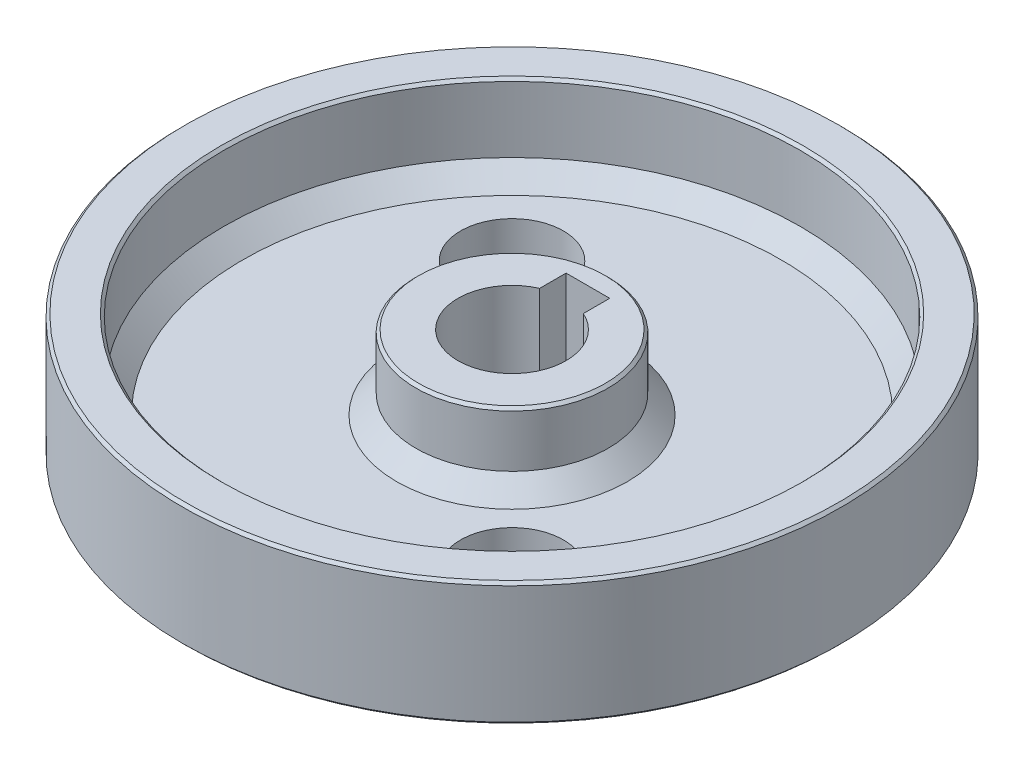
ISO-10303-21;
HEADER;
FILE_DESCRIPTION(('STEP AP214'),'2;1');
FILE_NAME('part.step','',(''),(''),'','','');
FILE_SCHEMA(('AUTOMOTIVE_DESIGN { 1 0 10303 214 1 1 1 1 }'));
ENDSEC;
DATA;
#1=APPLICATION_CONTEXT('core data for automotive mechanical design processes');
#2=APPLICATION_PROTOCOL_DEFINITION('international standard','automotive_design',2000,#1);
#3=PRODUCT_CONTEXT('',#1,'mechanical');
#4=PRODUCT('Part','Part','',(#3));
#5=PRODUCT_RELATED_PRODUCT_CATEGORY('part','',(#4));
#6=PRODUCT_DEFINITION_FORMATION('','',#4);
#7=PRODUCT_DEFINITION_CONTEXT('part definition',#1,'design');
#8=PRODUCT_DEFINITION('design','',#6,#7);
#9=PRODUCT_DEFINITION_SHAPE('','',#8);
#10=(LENGTH_UNIT() NAMED_UNIT(*) SI_UNIT(.MILLI.,.METRE.));
#11=(NAMED_UNIT(*) PLANE_ANGLE_UNIT() SI_UNIT($,.RADIAN.));
#12=(NAMED_UNIT(*) SI_UNIT($,.STERADIAN.) SOLID_ANGLE_UNIT());
#13=UNCERTAINTY_MEASURE_WITH_UNIT(LENGTH_MEASURE(1.E-05),#10,'distance_accuracy_value','');
#14=(GEOMETRIC_REPRESENTATION_CONTEXT(3) GLOBAL_UNCERTAINTY_ASSIGNED_CONTEXT((#13)) GLOBAL_UNIT_ASSIGNED_CONTEXT((#10,
#11,#12)) REPRESENTATION_CONTEXT('',''));
#15=CARTESIAN_POINT('',(0.,0.,0.));
#16=DIRECTION('',(0.,0.,1.));
#17=DIRECTION('',(1.,0.,0.));
#18=AXIS2_PLACEMENT_3D('',#15,#16,#17);
#19=CARTESIAN_POINT('',(0.,11.43,0.));
#20=DIRECTION('',(0.,1.,0.));
#21=DIRECTION('',(-1.,0.,0.));
#22=AXIS2_PLACEMENT_3D('',#19,#20,#21);
#23=CONICAL_SURFACE('',#22,26.924,0.785398163397438);
#24=CARTESIAN_POINT('',(0.,11.176,0.));
#25=DIRECTION('',(0.,-1.,0.));
#26=DIRECTION('',(0.,0.,-1.));
#27=AXIS2_PLACEMENT_3D('',#24,#25,#26);
#28=CIRCLE('',#27,26.67);
#29=CARTESIAN_POINT('',(0.,11.176,-26.67));
#30=VERTEX_POINT('',#29);
#31=EDGE_CURVE('E122',#30,#30,#28,.T.);
#32=ORIENTED_EDGE('',*,*,#31,.T.);
#33=EDGE_LOOP('',(#32));
#34=FACE_BOUND('',#33,.T.);
#35=CARTESIAN_POINT('',(0.,11.43,0.));
#36=DIRECTION('',(0.,1.,0.));
#37=DIRECTION('',(-1.,0.,0.));
#38=AXIS2_PLACEMENT_3D('',#35,#36,#37);
#39=CIRCLE('',#38,26.924);
#40=CARTESIAN_POINT('',(-26.924,11.43,0.));
#41=VERTEX_POINT('',#40);
#42=EDGE_CURVE('E19',#41,#41,#39,.F.);
#43=ORIENTED_EDGE('',*,*,#42,.F.);
#44=EDGE_LOOP('',(#43));
#45=FACE_BOUND('',#44,.T.);
#46=ADVANCED_FACE('F16',(#34,#45),#23,.F.);
#47=CARTESIAN_POINT('',(0.,0.,0.));
#48=DIRECTION('',(0.,-1.,0.));
#49=DIRECTION('',(0.,0.,-1.));
#50=AXIS2_PLACEMENT_3D('',#47,#48,#49);
#51=CYLINDRICAL_SURFACE('',#50,26.67);
#52=CARTESIAN_POINT('',(0.,5.08000000000003,0.));
#53=DIRECTION('',(0.,1.,0.));
#54=DIRECTION('',(0.,0.,1.));
#55=AXIS2_PLACEMENT_3D('',#52,#53,#54);
#56=CIRCLE('',#55,26.67);
#57=CARTESIAN_POINT('',(0.,5.08000000000003,26.67));
#58=VERTEX_POINT('',#57);
#59=EDGE_CURVE('E119',#58,#58,#56,.F.);
#60=ORIENTED_EDGE('',*,*,#59,.T.);
#61=EDGE_LOOP('',(#60));
#62=FACE_BOUND('',#61,.T.);
#63=ORIENTED_EDGE('',*,*,#31,.F.);
#64=EDGE_LOOP('',(#63));
#65=FACE_BOUND('',#64,.T.);
#66=ADVANCED_FACE('F155',(#62,#65),#51,.F.);
#67=CARTESIAN_POINT('',(0.,11.43,0.));
#68=DIRECTION('',(0.,1.,0.));
#69=DIRECTION('',(0.,0.,1.));
#70=AXIS2_PLACEMENT_3D('',#67,#68,#69);
#71=PLANE('',#70);
#72=CARTESIAN_POINT('',(0.,11.43,0.));
#73=DIRECTION('',(0.,-1.,0.));
#74=DIRECTION('',(0.,0.,-1.));
#75=AXIS2_PLACEMENT_3D('',#72,#73,#74);
#76=CIRCLE('',#75,30.226);
#77=CARTESIAN_POINT('',(0.,11.43,-30.226));
#78=VERTEX_POINT('',#77);
#79=EDGE_CURVE('E115',#78,#78,#76,.T.);
#80=ORIENTED_EDGE('',*,*,#79,.F.);
#81=EDGE_LOOP('',(#80));
#82=FACE_BOUND('',#81,.T.);
#83=ORIENTED_EDGE('',*,*,#42,.T.);
#84=EDGE_LOOP('',(#83));
#85=FACE_BOUND('',#84,.T.);
#86=ADVANCED_FACE('F151',(#82,#85),#71,.T.);
#87=CARTESIAN_POINT('',(0.,0.,0.));
#88=DIRECTION('',(0.,-1.,0.));
#89=DIRECTION('',(0.,0.,-1.));
#90=AXIS2_PLACEMENT_3D('',#87,#88,#89);
#91=CYLINDRICAL_SURFACE('',#90,8.89);
#92=CARTESIAN_POINT('',(0.,5.08,0.));
#93=DIRECTION('',(0.,-1.,0.));
#94=DIRECTION('',(0.,0.,-1.));
#95=AXIS2_PLACEMENT_3D('',#92,#93,#94);
#96=CIRCLE('',#95,8.89);
#97=CARTESIAN_POINT('',(0.,5.08,-8.89));
#98=VERTEX_POINT('',#97);
#99=EDGE_CURVE('E116',#98,#98,#96,.T.);
#100=ORIENTED_EDGE('',*,*,#99,.F.);
#101=EDGE_LOOP('',(#100));
#102=FACE_BOUND('',#101,.T.);
#103=CARTESIAN_POINT('',(0.,9.90599999999998,0.));
#104=DIRECTION('',(0.,-1.,0.));
#105=DIRECTION('',(0.,0.,-1.));
#106=AXIS2_PLACEMENT_3D('',#103,#104,#105);
#107=CIRCLE('',#106,8.89);
#108=CARTESIAN_POINT('',(0.,9.90599999999998,-8.89));
#109=VERTEX_POINT('',#108);
#110=EDGE_CURVE('E111',#109,#109,#107,.F.);
#111=ORIENTED_EDGE('',*,*,#110,.F.);
#112=EDGE_LOOP('',(#111));
#113=FACE_BOUND('',#112,.T.);
#114=ADVANCED_FACE('F154',(#102,#113),#91,.T.);
#115=CARTESIAN_POINT('',(0.,5.08000000000003,0.));
#116=DIRECTION('',(0.,1.,0.));
#117=DIRECTION('',(0.,0.,1.));
#118=AXIS2_PLACEMENT_3D('',#115,#116,#117);
#119=CONICAL_SURFACE('',#118,26.67,0.785398163397441);
#120=ORIENTED_EDGE('',*,*,#59,.F.);
#121=EDGE_LOOP('',(#120));
#122=FACE_BOUND('',#121,.T.);
#123=CARTESIAN_POINT('',(0.,3.302,0.));
#124=DIRECTION('',(0.,1.,0.));
#125=DIRECTION('',(0.,0.,1.));
#126=AXIS2_PLACEMENT_3D('',#123,#124,#125);
#127=CIRCLE('',#126,24.892);
#128=CARTESIAN_POINT('',(0.,3.302,24.892));
#129=VERTEX_POINT('',#128);
#130=EDGE_CURVE('E114',#129,#129,#127,.F.);
#131=ORIENTED_EDGE('',*,*,#130,.T.);
#132=EDGE_LOOP('',(#131));
#133=FACE_BOUND('',#132,.T.);
#134=ADVANCED_FACE('F218',(#122,#133),#119,.F.);
#135=CARTESIAN_POINT('',(0.,3.302,0.));
#136=DIRECTION('',(0.,-1.,0.));
#137=DIRECTION('',(0.,0.,-1.));
#138=AXIS2_PLACEMENT_3D('',#135,#136,#137);
#139=CONICAL_SURFACE('',#138,10.668,0.78539816339745);
#140=CARTESIAN_POINT('',(0.,3.302,0.));
#141=DIRECTION('',(0.,-1.,0.));
#142=DIRECTION('',(0.,0.,-1.));
#143=AXIS2_PLACEMENT_3D('',#140,#141,#142);
#144=CIRCLE('',#143,10.668);
#145=CARTESIAN_POINT('',(0.,3.302,-10.668));
#146=VERTEX_POINT('',#145);
#147=EDGE_CURVE('E110',#146,#146,#144,.F.);
#148=ORIENTED_EDGE('',*,*,#147,.T.);
#149=EDGE_LOOP('',(#148));
#150=FACE_BOUND('',#149,.T.);
#151=ORIENTED_EDGE('',*,*,#99,.T.);
#152=EDGE_LOOP('',(#151));
#153=FACE_BOUND('',#152,.T.);
#154=ADVANCED_FACE('F215',(#150,#153),#139,.T.);
#155=CARTESIAN_POINT('',(0.,11.176,0.));
#156=DIRECTION('',(0.,-1.,0.));
#157=DIRECTION('',(0.,0.,-1.));
#158=AXIS2_PLACEMENT_3D('',#155,#156,#157);
#159=CONICAL_SURFACE('',#158,30.48,0.785398163397469);
#160=ORIENTED_EDGE('',*,*,#79,.T.);
#161=EDGE_LOOP('',(#160));
#162=FACE_BOUND('',#161,.T.);
#163=CARTESIAN_POINT('',(0.,11.176,0.));
#164=DIRECTION('',(0.,-1.,0.));
#165=DIRECTION('',(0.,0.,-1.));
#166=AXIS2_PLACEMENT_3D('',#163,#164,#165);
#167=CIRCLE('',#166,30.48);
#168=CARTESIAN_POINT('',(0.,11.176,-30.48));
#169=VERTEX_POINT('',#168);
#170=EDGE_CURVE('E106',#169,#169,#167,.T.);
#171=ORIENTED_EDGE('',*,*,#170,.F.);
#172=EDGE_LOOP('',(#171));
#173=FACE_BOUND('',#172,.T.);
#174=ADVANCED_FACE('F148',(#162,#173),#159,.T.);
#175=CARTESIAN_POINT('',(0.,9.90599999999998,0.));
#176=DIRECTION('',(0.,-1.,0.));
#177=DIRECTION('',(0.,0.,-1.));
#178=AXIS2_PLACEMENT_3D('',#175,#176,#177);
#179=CONICAL_SURFACE('',#178,8.89,0.785398163397435);
#180=ORIENTED_EDGE('',*,*,#110,.T.);
#181=EDGE_LOOP('',(#180));
#182=FACE_BOUND('',#181,.T.);
#183=CARTESIAN_POINT('',(0.,10.16,0.));
#184=DIRECTION('',(0.,-1.,0.));
#185=DIRECTION('',(0.,0.,-1.));
#186=AXIS2_PLACEMENT_3D('',#183,#184,#185);
#187=CIRCLE('',#186,8.63599999999998);
#188=CARTESIAN_POINT('',(0.,10.16,-8.63599999999998));
#189=VERTEX_POINT('',#188);
#190=EDGE_CURVE('E109',#189,#189,#187,.F.);
#191=ORIENTED_EDGE('',*,*,#190,.F.);
#192=EDGE_LOOP('',(#191));
#193=FACE_BOUND('',#192,.T.);
#194=ADVANCED_FACE('F208',(#182,#193),#179,.T.);
#195=CARTESIAN_POINT('',(24.892,3.302,0.));
#196=DIRECTION('',(0.,-1.,0.));
#197=DIRECTION('',(0.,0.,-1.));
#198=AXIS2_PLACEMENT_3D('',#195,#196,#197);
#199=PLANE('',#198);
#200=ORIENTED_EDGE('',*,*,#147,.F.);
#201=EDGE_LOOP('',(#200));
#202=FACE_BOUND('',#201,.T.);
#203=ORIENTED_EDGE('',*,*,#130,.F.);
#204=EDGE_LOOP('',(#203));
#205=FACE_BOUND('',#204,.T.);
#206=CARTESIAN_POINT('',(-12.375217198902,3.302,-12.3743686707646));
#207=DIRECTION('',(0.,1.,0.));
#208=DIRECTION('',(0.,0.,1.));
#209=AXIS2_PLACEMENT_3D('',#206,#207,#208);
#210=CIRCLE('',#209,4.7625);
#211=CARTESIAN_POINT('',(-12.375217198902,3.302,-7.61186867076458));
#212=VERTEX_POINT('',#211);
#213=EDGE_CURVE('E105',#212,#212,#210,.F.);
#214=ORIENTED_EDGE('',*,*,#213,.T.);
#215=EDGE_LOOP('',(#214));
#216=FACE_BOUND('',#215,.T.);
#217=CARTESIAN_POINT('',(12.3743686707647,3.302,12.3752171989019));
#218=DIRECTION('',(0.,1.,0.));
#219=DIRECTION('',(0.,0.,1.));
#220=AXIS2_PLACEMENT_3D('',#217,#218,#219);
#221=CIRCLE('',#220,4.7625);
#222=CARTESIAN_POINT('',(12.3743686707647,3.302,17.1377171989019));
#223=VERTEX_POINT('',#222);
#224=EDGE_CURVE('E137',#223,#223,#221,.F.);
#225=ORIENTED_EDGE('',*,*,#224,.T.);
#226=EDGE_LOOP('',(#225));
#227=FACE_BOUND('',#226,.T.);
#228=ADVANCED_FACE('F204',(#202,#205,#216,#227),#199,.F.);
#229=CARTESIAN_POINT('',(0.,11.43,0.));
#230=DIRECTION('',(0.,-1.,0.));
#231=DIRECTION('',(0.,0.,-1.));
#232=AXIS2_PLACEMENT_3D('',#229,#230,#231);
#233=CYLINDRICAL_SURFACE('',#232,30.48);
#234=ORIENTED_EDGE('',*,*,#170,.T.);
#235=EDGE_LOOP('',(#234));
#236=FACE_BOUND('',#235,.T.);
#237=CARTESIAN_POINT('',(0.,0.254000000000004,0.));
#238=DIRECTION('',(0.,1.,0.));
#239=DIRECTION('',(0.,0.,1.));
#240=AXIS2_PLACEMENT_3D('',#237,#238,#239);
#241=CIRCLE('',#240,30.48);
#242=CARTESIAN_POINT('',(0.,0.254000000000005,30.48));
#243=VERTEX_POINT('',#242);
#244=EDGE_CURVE('E100',#243,#243,#241,.F.);
#245=ORIENTED_EDGE('',*,*,#244,.F.);
#246=EDGE_LOOP('',(#245));
#247=FACE_BOUND('',#246,.T.);
#248=ADVANCED_FACE('F201',(#236,#247),#233,.T.);
#249=CARTESIAN_POINT('',(0.,10.16,0.));
#250=DIRECTION('',(0.,1.,0.));
#251=DIRECTION('',(0.,0.,1.));
#252=AXIS2_PLACEMENT_3D('',#249,#250,#251);
#253=PLANE('',#252);
#254=DIRECTION('',(0.,0.,-1.));
#255=VECTOR('',#254,1.);
#256=CARTESIAN_POINT('',(2.0193,10.16,-7.0193));
#257=LINE('',#256,#255);
#258=CARTESIAN_POINT('',(2.0193,10.16,-7.0193));
#259=VERTEX_POINT('',#258);
#260=CARTESIAN_POINT('',(2.0193,10.16,-4.57410401171639));
#261=VERTEX_POINT('',#260);
#262=EDGE_CURVE('E54',#259,#261,#257,.F.);
#263=ORIENTED_EDGE('',*,*,#262,.T.);
#264=CARTESIAN_POINT('',(0.,10.16,0.));
#265=DIRECTION('',(0.,-1.,0.));
#266=DIRECTION('',(0.,0.,-1.));
#267=AXIS2_PLACEMENT_3D('',#264,#265,#266);
#268=CIRCLE('',#267,5.);
#269=CARTESIAN_POINT('',(-2.0193,10.16,-4.57410401171639));
#270=VERTEX_POINT('',#269);
#271=EDGE_CURVE('E56',#261,#270,#268,.T.);
#272=ORIENTED_EDGE('',*,*,#271,.T.);
#273=DIRECTION('',(0.,0.,1.));
#274=VECTOR('',#273,1.);
#275=CARTESIAN_POINT('',(-2.0193,10.16,-7.0193));
#276=LINE('',#275,#274);
#277=CARTESIAN_POINT('',(-2.0193,10.16,-7.0193));
#278=VERTEX_POINT('',#277);
#279=EDGE_CURVE('E60',#270,#278,#276,.F.);
#280=ORIENTED_EDGE('',*,*,#279,.T.);
#281=DIRECTION('',(-1.,0.,0.));
#282=VECTOR('',#281,1.);
#283=CARTESIAN_POINT('',(-2.0193,10.16,-7.0193));
#284=LINE('',#283,#282);
#285=EDGE_CURVE('E85',#278,#259,#284,.F.);
#286=ORIENTED_EDGE('',*,*,#285,.T.);
#287=EDGE_LOOP('',(#263,#272,#280,#286));
#288=FACE_BOUND('',#287,.T.);
#289=ORIENTED_EDGE('',*,*,#190,.T.);
#290=EDGE_LOOP('',(#289));
#291=FACE_BOUND('',#290,.T.);
#292=ADVANCED_FACE('F58',(#288,#291),#253,.T.);
#293=CARTESIAN_POINT('',(12.3743686707647,0.,12.3752171989019));
#294=DIRECTION('',(0.,1.,0.));
#295=DIRECTION('',(0.,0.,1.));
#296=AXIS2_PLACEMENT_3D('',#293,#294,#295);
#297=CYLINDRICAL_SURFACE('',#296,4.7625);
#298=CARTESIAN_POINT('',(12.3743686707647,0.,12.3752171989019));
#299=DIRECTION('',(0.,1.,0.));
#300=DIRECTION('',(0.,0.,1.));
#301=AXIS2_PLACEMENT_3D('',#298,#299,#300);
#302=CIRCLE('',#301,4.7625);
#303=CARTESIAN_POINT('',(12.3743686707647,0.,17.1377171989019));
#304=VERTEX_POINT('',#303);
#305=EDGE_CURVE('E96',#304,#304,#302,.F.);
#306=ORIENTED_EDGE('',*,*,#305,.T.);
#307=EDGE_LOOP('',(#306));
#308=FACE_BOUND('',#307,.T.);
#309=ORIENTED_EDGE('',*,*,#224,.F.);
#310=EDGE_LOOP('',(#309));
#311=FACE_BOUND('',#310,.T.);
#312=ADVANCED_FACE('F194',(#308,#311),#297,.F.);
#313=CARTESIAN_POINT('',(-12.375217198902,0.,-12.3743686707646));
#314=DIRECTION('',(0.,1.,0.));
#315=DIRECTION('',(0.,0.,1.));
#316=AXIS2_PLACEMENT_3D('',#313,#314,#315);
#317=CYLINDRICAL_SURFACE('',#316,4.7625);
#318=CARTESIAN_POINT('',(-12.375217198902,0.,-12.3743686707646));
#319=DIRECTION('',(0.,1.,0.));
#320=DIRECTION('',(0.,0.,1.));
#321=AXIS2_PLACEMENT_3D('',#318,#319,#320);
#322=CIRCLE('',#321,4.7625);
#323=CARTESIAN_POINT('',(-12.375217198902,0.,-7.61186867076458));
#324=VERTEX_POINT('',#323);
#325=EDGE_CURVE('E130',#324,#324,#322,.F.);
#326=ORIENTED_EDGE('',*,*,#325,.T.);
#327=EDGE_LOOP('',(#326));
#328=FACE_BOUND('',#327,.T.);
#329=ORIENTED_EDGE('',*,*,#213,.F.);
#330=EDGE_LOOP('',(#329));
#331=FACE_BOUND('',#330,.T.);
#332=ADVANCED_FACE('F190',(#328,#331),#317,.F.);
#333=CARTESIAN_POINT('',(0.,0.254000000000005,0.));
#334=DIRECTION('',(0.,1.,0.));
#335=DIRECTION('',(0.,0.,1.));
#336=AXIS2_PLACEMENT_3D('',#333,#334,#335);
#337=CONICAL_SURFACE('',#336,30.48,0.785398163397441);
#338=CARTESIAN_POINT('',(0.,0.,0.));
#339=DIRECTION('',(0.,1.,0.));
#340=DIRECTION('',(0.,0.,1.));
#341=AXIS2_PLACEMENT_3D('',#338,#339,#340);
#342=CIRCLE('',#341,30.226);
#343=CARTESIAN_POINT('',(0.,0.,30.226));
#344=VERTEX_POINT('',#343);
#345=EDGE_CURVE('E127',#344,#344,#342,.T.);
#346=ORIENTED_EDGE('',*,*,#345,.T.);
#347=EDGE_LOOP('',(#346));
#348=FACE_BOUND('',#347,.T.);
#349=ORIENTED_EDGE('',*,*,#244,.T.);
#350=EDGE_LOOP('',(#349));
#351=FACE_BOUND('',#350,.T.);
#352=ADVANCED_FACE('F186',(#348,#351),#337,.T.);
#353=CARTESIAN_POINT('',(2.0193,0.,-7.0193));
#354=DIRECTION('',(1.,0.,0.));
#355=DIRECTION('',(0.,0.,-1.));
#356=AXIS2_PLACEMENT_3D('',#353,#354,#355);
#357=PLANE('',#356);
#358=DIRECTION('',(0.,1.,0.));
#359=VECTOR('',#358,1.);
#360=CARTESIAN_POINT('',(2.0193,0.,-7.0193));
#361=LINE('',#360,#359);
#362=CARTESIAN_POINT('',(2.0193,0.,-7.0193));
#363=VERTEX_POINT('',#362);
#364=EDGE_CURVE('E71',#259,#363,#361,.F.);
#365=ORIENTED_EDGE('',*,*,#364,.T.);
#366=DIRECTION('',(0.,0.,1.));
#367=VECTOR('',#366,1.);
#368=CARTESIAN_POINT('',(2.0193,0.,0.));
#369=LINE('',#368,#367);
#370=CARTESIAN_POINT('',(2.0193,0.,-4.57410401171639));
#371=VERTEX_POINT('',#370);
#372=EDGE_CURVE('E126',#363,#371,#369,.T.);
#373=ORIENTED_EDGE('',*,*,#372,.T.);
#374=DIRECTION('',(0.,-1.,0.));
#375=VECTOR('',#374,1.);
#376=CARTESIAN_POINT('',(2.0193,11.43,-4.57410401171639));
#377=LINE('',#376,#375);
#378=EDGE_CURVE('E65',#371,#261,#377,.F.);
#379=ORIENTED_EDGE('',*,*,#378,.T.);
#380=ORIENTED_EDGE('',*,*,#262,.F.);
#381=EDGE_LOOP('',(#365,#373,#379,#380));
#382=FACE_BOUND('',#381,.T.);
#383=ADVANCED_FACE('F183',(#382),#357,.F.);
#384=CARTESIAN_POINT('',(0.,11.43,0.));
#385=DIRECTION('',(0.,-1.,0.));
#386=DIRECTION('',(0.,0.,-1.));
#387=AXIS2_PLACEMENT_3D('',#384,#385,#386);
#388=CYLINDRICAL_SURFACE('',#387,5.);
#389=ORIENTED_EDGE('',*,*,#271,.F.);
#390=ORIENTED_EDGE('',*,*,#378,.F.);
#391=CARTESIAN_POINT('',(0.,0.,0.));
#392=DIRECTION('',(0.,-1.,0.));
#393=DIRECTION('',(0.,0.,-1.));
#394=AXIS2_PLACEMENT_3D('',#391,#392,#393);
#395=CIRCLE('',#394,5.);
#396=CARTESIAN_POINT('',(-2.0193,0.,-4.57410401171639));
#397=VERTEX_POINT('',#396);
#398=EDGE_CURVE('E76',#371,#397,#395,.T.);
#399=ORIENTED_EDGE('',*,*,#398,.T.);
#400=DIRECTION('',(0.,1.,0.));
#401=VECTOR('',#400,1.);
#402=CARTESIAN_POINT('',(-2.0193,0.,-4.57410401171639));
#403=LINE('',#402,#401);
#404=EDGE_CURVE('E64',#397,#270,#403,.T.);
#405=ORIENTED_EDGE('',*,*,#404,.T.);
#406=EDGE_LOOP('',(#389,#390,#399,#405));
#407=FACE_BOUND('',#406,.T.);
#408=ADVANCED_FACE('F74',(#407),#388,.F.);
#409=CARTESIAN_POINT('',(-2.0193,0.,-7.0193));
#410=DIRECTION('',(-1.,0.,0.));
#411=DIRECTION('',(0.,0.,1.));
#412=AXIS2_PLACEMENT_3D('',#409,#410,#411);
#413=PLANE('',#412);
#414=ORIENTED_EDGE('',*,*,#404,.F.);
#415=DIRECTION('',(0.,0.,1.));
#416=VECTOR('',#415,1.);
#417=CARTESIAN_POINT('',(-2.0193,0.,0.));
#418=LINE('',#417,#416);
#419=CARTESIAN_POINT('',(-2.0193,0.,-7.0193));
#420=VERTEX_POINT('',#419);
#421=EDGE_CURVE('E25',#397,#420,#418,.F.);
#422=ORIENTED_EDGE('',*,*,#421,.T.);
#423=DIRECTION('',(0.,1.,0.));
#424=VECTOR('',#423,1.);
#425=CARTESIAN_POINT('',(-2.0193,0.,-7.0193));
#426=LINE('',#425,#424);
#427=EDGE_CURVE('E33',#420,#278,#426,.T.);
#428=ORIENTED_EDGE('',*,*,#427,.T.);
#429=ORIENTED_EDGE('',*,*,#279,.F.);
#430=EDGE_LOOP('',(#414,#422,#428,#429));
#431=FACE_BOUND('',#430,.T.);
#432=ADVANCED_FACE('F68',(#431),#413,.F.);
#433=CARTESIAN_POINT('',(-2.0193,0.,-7.0193));
#434=DIRECTION('',(0.,0.,-1.));
#435=DIRECTION('',(-1.,0.,0.));
#436=AXIS2_PLACEMENT_3D('',#433,#434,#435);
#437=PLANE('',#436);
#438=ORIENTED_EDGE('',*,*,#427,.F.);
#439=DIRECTION('',(1.,0.,0.));
#440=VECTOR('',#439,1.);
#441=CARTESIAN_POINT('',(0.,0.,-7.0193));
#442=LINE('',#441,#440);
#443=EDGE_CURVE('E11',#420,#363,#442,.T.);
#444=ORIENTED_EDGE('',*,*,#443,.T.);
#445=ORIENTED_EDGE('',*,*,#364,.F.);
#446=ORIENTED_EDGE('',*,*,#285,.F.);
#447=EDGE_LOOP('',(#438,#444,#445,#446));
#448=FACE_BOUND('',#447,.T.);
#449=ADVANCED_FACE('F169',(#448),#437,.F.);
#450=CARTESIAN_POINT('',(0.,0.,0.));
#451=DIRECTION('',(0.,1.,0.));
#452=DIRECTION('',(0.,0.,1.));
#453=AXIS2_PLACEMENT_3D('',#450,#451,#452);
#454=PLANE('',#453);
#455=ORIENTED_EDGE('',*,*,#421,.F.);
#456=ORIENTED_EDGE('',*,*,#398,.F.);
#457=ORIENTED_EDGE('',*,*,#372,.F.);
#458=ORIENTED_EDGE('',*,*,#443,.F.);
#459=EDGE_LOOP('',(#455,#456,#457,#458));
#460=FACE_BOUND('',#459,.T.);
#461=ORIENTED_EDGE('',*,*,#345,.F.);
#462=EDGE_LOOP('',(#461));
#463=FACE_BOUND('',#462,.T.);
#464=ORIENTED_EDGE('',*,*,#325,.F.);
#465=EDGE_LOOP('',(#464));
#466=FACE_BOUND('',#465,.T.);
#467=ORIENTED_EDGE('',*,*,#305,.F.);
#468=EDGE_LOOP('',(#467));
#469=FACE_BOUND('',#468,.T.);
#470=ADVANCED_FACE('F167',(#460,#463,#466,#469),#454,.F.);
#471=CLOSED_SHELL('',(#46,#66,#86,#114,#134,#154,#174,#194,#228,#248,#292,#312,#332,#352,#383,
#408,#432,#449,#470));
#472=MANIFOLD_SOLID_BREP('B1',#471);
#473=ADVANCED_BREP_SHAPE_REPRESENTATION('',(#18,#472),#14);
#474=SHAPE_DEFINITION_REPRESENTATION(#9,#473);
ENDSEC;
END-ISO-10303-21;
